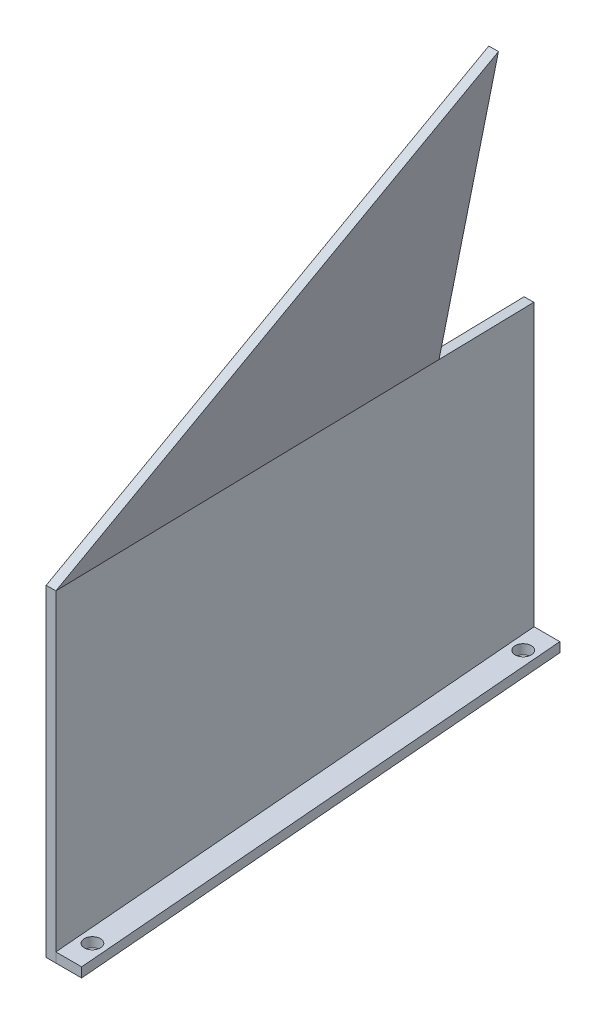
ISO-10303-21;
HEADER;
FILE_DESCRIPTION(('STEP AP214'),'2;1');
FILE_NAME('part.step','',(''),(''),'','','');
FILE_SCHEMA(('AUTOMOTIVE_DESIGN { 1 0 10303 214 1 1 1 1 }'));
ENDSEC;
DATA;
#1=APPLICATION_CONTEXT('core data for automotive mechanical design processes');
#2=APPLICATION_PROTOCOL_DEFINITION('international standard','automotive_design',2000,#1);
#3=PRODUCT_CONTEXT('',#1,'mechanical');
#4=PRODUCT('Part','Part','',(#3));
#5=PRODUCT_RELATED_PRODUCT_CATEGORY('part','',(#4));
#6=PRODUCT_DEFINITION_FORMATION('','',#4);
#7=PRODUCT_DEFINITION_CONTEXT('part definition',#1,'design');
#8=PRODUCT_DEFINITION('design','',#6,#7);
#9=PRODUCT_DEFINITION_SHAPE('','',#8);
#10=(LENGTH_UNIT() NAMED_UNIT(*) SI_UNIT(.MILLI.,.METRE.));
#11=(NAMED_UNIT(*) PLANE_ANGLE_UNIT() SI_UNIT($,.RADIAN.));
#12=(NAMED_UNIT(*) SI_UNIT($,.STERADIAN.) SOLID_ANGLE_UNIT());
#13=UNCERTAINTY_MEASURE_WITH_UNIT(LENGTH_MEASURE(1.E-05),#10,'distance_accuracy_value','');
#14=(GEOMETRIC_REPRESENTATION_CONTEXT(3) GLOBAL_UNCERTAINTY_ASSIGNED_CONTEXT((#13)) GLOBAL_UNIT_ASSIGNED_CONTEXT((#10,
#11,#12)) REPRESENTATION_CONTEXT('',''));
#15=CARTESIAN_POINT('',(0.,0.,0.));
#16=DIRECTION('',(0.,0.,1.));
#17=DIRECTION('',(1.,0.,0.));
#18=AXIS2_PLACEMENT_3D('',#15,#16,#17);
#19=CARTESIAN_POINT('',(-203.417237749036,0.,16.7339405979292));
#20=DIRECTION('',(0.99673005629727,0.,-0.0808034335510675));
#21=DIRECTION('',(-0.0808034335510675,0.,-0.99673005629727));
#22=AXIS2_PLACEMENT_3D('',#19,#20,#21);
#23=PLANE('',#22);
#24=DIRECTION('',(0.,-1.,0.));
#25=VECTOR('',#24,1.);
#26=CARTESIAN_POINT('',(-188.85310393892,113.192378864667,196.386082524594));
#27=LINE('',#26,#25);
#28=CARTESIAN_POINT('',(-188.85310393892,113.192378864667,196.386082524594));
#29=VERTEX_POINT('',#28);
#30=CARTESIAN_POINT('',(-188.85310393892,23.,196.386082524594));
#31=VERTEX_POINT('',#30);
#32=EDGE_CURVE('E111',#29,#31,#27,.T.);
#33=ORIENTED_EDGE('',*,*,#32,.F.);
#34=DIRECTION('',(-0.0806591251309432,-0.0597381729358026,-0.99494997674627));
#35=VECTOR('',#34,1.);
#36=CARTESIAN_POINT('',(-175.773130317925,122.879735687572,357.730746614663));
#37=LINE('',#36,#35);
#38=CARTESIAN_POINT('',(-186.258816584948,115.113773205917,228.387249637648));
#39=VERTEX_POINT('',#38);
#40=EDGE_CURVE('E263',#39,#29,#37,.T.);
#41=ORIENTED_EDGE('',*,*,#40,.F.);
#42=CARTESIAN_POINT('',(-175.773130317925,122.879735687572,357.730746614663));
#43=VERTEX_POINT('',#42);
#44=EDGE_CURVE('E119',#43,#39,#37,.T.);
#45=ORIENTED_EDGE('',*,*,#44,.F.);
#46=DIRECTION('',(0.,1.,0.));
#47=VECTOR('',#46,1.);
#48=CARTESIAN_POINT('',(-175.773130317925,22.8797356875718,357.730746614663));
#49=LINE('',#48,#47);
#50=CARTESIAN_POINT('',(-175.773220921356,25.8797365209757,357.730746614663));
#51=VERTEX_POINT('',#50);
#52=EDGE_CURVE('E276',#51,#43,#49,.T.);
#53=ORIENTED_EDGE('',*,*,#52,.F.);
#54=DIRECTION('',(-0.0808034112503375,0.00074295002248931,-0.996729781212327));
#55=VECTOR('',#54,1.);
#56=CARTESIAN_POINT('',(-203.415668854651,26.1338968875955,16.7532932927375));
#57=LINE('',#56,#55);
#58=CARTESIAN_POINT('',(-176.208192950609,25.8837367208027,352.364142970064));
#59=VERTEX_POINT('',#58);
#60=EDGE_CURVE('E127',#51,#59,#57,.T.);
#61=ORIENTED_EDGE('',*,*,#60,.T.);
#62=DIRECTION('',(-0.080769976135857,0.000742952042466884,-0.996732491181699));
#63=VECTOR('',#62,1.);
#64=CARTESIAN_POINT('',(-175.773130317925,25.8797348541681,357.732982776851));
#65=LINE('',#64,#63);
#66=CARTESIAN_POINT('',(-176.208199581132,25.88373678178,352.364061163911));
#67=VERTEX_POINT('',#66);
#68=EDGE_CURVE('E249',#59,#67,#65,.T.);
#69=ORIENTED_EDGE('',*,*,#68,.T.);
#70=DIRECTION('',(-0.0705639806435784,0.487219606824506,-0.870423907852666));
#71=VECTOR('',#70,1.);
#72=CARTESIAN_POINT('',(-196.068389250579,163.011400413505,107.383778800142));
#73=LINE('',#72,#71);
#74=CARTESIAN_POINT('',(-175.773130317925,22.8797356875718,357.730746614663));
#75=VERTEX_POINT('',#74);
#76=EDGE_CURVE('E264',#75,#67,#73,.T.);
#77=ORIENTED_EDGE('',*,*,#76,.F.);
#78=DIRECTION('',(0.0808034112503379,-0.000742950022489317,0.996729781212327));
#79=VECTOR('',#78,1.);
#80=CARTESIAN_POINT('',(-188.85310393892,23.,196.386082524594));
#81=LINE('',#80,#79);
#82=EDGE_CURVE('E309',#31,#75,#81,.T.);
#83=ORIENTED_EDGE('',*,*,#82,.F.);
#84=EDGE_LOOP('',(#33,#41,#45,#53,#61,#69,#77,#83));
#85=FACE_BOUND('',#84,.T.);
#86=ADVANCED_FACE('F101',(#85),#23,.T.);
#87=CARTESIAN_POINT('',(-206.417237749036,0.,16.7339405979292));
#88=DIRECTION('',(0.99673005629727,0.,-0.0808034335510675));
#89=DIRECTION('',(-0.0808034335510675,0.,-0.99673005629727));
#90=AXIS2_PLACEMENT_3D('',#87,#88,#89);
#91=PLANE('',#90);
#92=DIRECTION('',(0.,-1.,0.));
#93=VECTOR('',#92,1.);
#94=CARTESIAN_POINT('',(-191.85310393892,113.192378864667,196.386082524594));
#95=LINE('',#94,#93);
#96=CARTESIAN_POINT('',(-191.85310393892,113.192378864667,196.386082524594));
#97=VERTEX_POINT('',#96);
#98=CARTESIAN_POINT('',(-191.85310393892,23.,196.386082524594));
#99=VERTEX_POINT('',#98);
#100=EDGE_CURVE('E12',#97,#99,#95,.T.);
#101=ORIENTED_EDGE('',*,*,#100,.T.);
#102=DIRECTION('',(0.0808034112503379,-0.000742950022489317,0.996729781212327));
#103=VECTOR('',#102,1.);
#104=CARTESIAN_POINT('',(-191.85310393892,23.,196.386082524594));
#105=LINE('',#104,#103);
#106=CARTESIAN_POINT('',(-178.773130317925,22.8797356875718,357.730746614663));
#107=VERTEX_POINT('',#106);
#108=EDGE_CURVE('E306',#99,#107,#105,.T.);
#109=ORIENTED_EDGE('',*,*,#108,.T.);
#110=DIRECTION('',(0.,1.,0.));
#111=VECTOR('',#110,1.);
#112=CARTESIAN_POINT('',(-178.773130317925,22.8797356875718,357.730746614663));
#113=LINE('',#112,#111);
#114=CARTESIAN_POINT('',(-178.773130317925,122.879735687572,357.730746614663));
#115=VERTEX_POINT('',#114);
#116=EDGE_CURVE('E314',#107,#115,#113,.T.);
#117=ORIENTED_EDGE('',*,*,#116,.T.);
#118=DIRECTION('',(-0.0806591251309432,-0.0597381729358026,-0.99494997674627));
#119=VECTOR('',#118,1.);
#120=CARTESIAN_POINT('',(-178.773130317925,122.879735687572,357.730746614663));
#121=LINE('',#120,#119);
#122=CARTESIAN_POINT('',(-189.258816584948,115.113773205917,228.387249637648));
#123=VERTEX_POINT('',#122);
#124=EDGE_CURVE('E207',#115,#123,#121,.T.);
#125=ORIENTED_EDGE('',*,*,#124,.T.);
#126=EDGE_CURVE('E104',#123,#97,#121,.T.);
#127=ORIENTED_EDGE('',*,*,#126,.T.);
#128=EDGE_LOOP('',(#101,#109,#117,#125,#127));
#129=FACE_BOUND('',#128,.T.);
#130=ADVANCED_FACE('F393',(#129),#91,.F.);
#131=CARTESIAN_POINT('',(-178.773130317925,122.879735687572,357.730746614663));
#132=DIRECTION('',(0.,-0.99820237497231,0.0599334514243942));
#133=DIRECTION('',(0.,-0.0599334514243942,-0.99820237497231));
#134=AXIS2_PLACEMENT_3D('',#131,#132,#133);
#135=PLANE('',#134);
#136=ORIENTED_EDGE('',*,*,#126,.F.);
#137=DIRECTION('',(1.,0.,0.));
#138=VECTOR('',#137,1.);
#139=CARTESIAN_POINT('',(-189.258816584948,115.113773205917,228.387249637648));
#140=LINE('',#139,#138);
#141=EDGE_CURVE('E196',#123,#39,#140,.T.);
#142=ORIENTED_EDGE('',*,*,#141,.T.);
#143=ORIENTED_EDGE('',*,*,#40,.T.);
#144=DIRECTION('',(1.,0.,0.));
#145=VECTOR('',#144,1.);
#146=CARTESIAN_POINT('',(-191.85310393892,113.192378864667,196.386082524594));
#147=LINE('',#146,#145);
#148=EDGE_CURVE('E265',#97,#29,#147,.T.);
#149=ORIENTED_EDGE('',*,*,#148,.F.);
#150=EDGE_LOOP('',(#136,#142,#143,#149));
#151=FACE_BOUND('',#150,.T.);
#152=ADVANCED_FACE('F416',(#151),#135,.F.);
#153=CARTESIAN_POINT('',(-178.773130317925,22.8797356875718,357.730746614663));
#154=DIRECTION('',(0.,0.,-1.));
#155=DIRECTION('',(0.,1.,0.));
#156=AXIS2_PLACEMENT_3D('',#153,#154,#155);
#157=PLANE('',#156);
#158=DIRECTION('',(1.,0.,0.));
#159=VECTOR('',#158,1.);
#160=CARTESIAN_POINT('',(-178.773130317925,22.8797356875718,357.730746614663));
#161=LINE('',#160,#159);
#162=EDGE_CURVE('E317',#107,#75,#161,.T.);
#163=ORIENTED_EDGE('',*,*,#162,.T.);
#164=DIRECTION('',(-6.04022702999892E-05,0.999999998175783,0.));
#165=VECTOR('',#164,1.);
#166=CARTESIAN_POINT('',(-175.77313032887,22.8799168943823,357.730746614663));
#167=LINE('',#166,#165);
#168=EDGE_CURVE('E258',#75,#51,#167,.T.);
#169=ORIENTED_EDGE('',*,*,#168,.T.);
#170=ORIENTED_EDGE('',*,*,#52,.T.);
#171=DIRECTION('',(1.,0.,0.));
#172=VECTOR('',#171,1.);
#173=CARTESIAN_POINT('',(-178.773130317925,122.879735687572,357.730746614663));
#174=LINE('',#173,#172);
#175=EDGE_CURVE('E329',#115,#43,#174,.T.);
#176=ORIENTED_EDGE('',*,*,#175,.F.);
#177=ORIENTED_EDGE('',*,*,#116,.F.);
#178=EDGE_LOOP('',(#163,#169,#170,#176,#177));
#179=FACE_BOUND('',#178,.T.);
#180=ADVANCED_FACE('F389',(#179),#157,.F.);
#181=CARTESIAN_POINT('',(-191.85310393892,23.,196.386082524594));
#182=DIRECTION('',(0.,0.999999722198777,0.000745387395963266));
#183=DIRECTION('',(0.,-0.000745387395963266,0.999999722198777));
#184=AXIS2_PLACEMENT_3D('',#181,#182,#183);
#185=PLANE('',#184);
#186=ORIENTED_EDGE('',*,*,#82,.T.);
#187=ORIENTED_EDGE('',*,*,#162,.F.);
#188=ORIENTED_EDGE('',*,*,#108,.F.);
#189=DIRECTION('',(1.,0.,0.));
#190=VECTOR('',#189,1.);
#191=CARTESIAN_POINT('',(-191.85310393892,23.,196.386082524594));
#192=LINE('',#191,#190);
#193=EDGE_CURVE('E313',#99,#31,#192,.T.);
#194=ORIENTED_EDGE('',*,*,#193,.T.);
#195=EDGE_LOOP('',(#186,#187,#188,#194));
#196=FACE_BOUND('',#195,.T.);
#197=ADVANCED_FACE('F385',(#196),#185,.F.);
#198=CARTESIAN_POINT('',(-191.85310393892,113.192378864667,196.386082524594));
#199=DIRECTION('',(0.,0.,1.));
#200=DIRECTION('',(1.,0.,0.));
#201=AXIS2_PLACEMENT_3D('',#198,#199,#200);
#202=PLANE('',#201);
#203=ORIENTED_EDGE('',*,*,#32,.T.);
#204=ORIENTED_EDGE('',*,*,#193,.F.);
#205=ORIENTED_EDGE('',*,*,#100,.F.);
#206=ORIENTED_EDGE('',*,*,#148,.T.);
#207=EDGE_LOOP('',(#203,#204,#205,#206));
#208=FACE_BOUND('',#207,.T.);
#209=ADVANCED_FACE('F423',(#208),#202,.F.);
#210=CARTESIAN_POINT('',(-175.773130317925,25.8797348541681,357.732982776851));
#211=DIRECTION('',(-0.996732768075282,-6.02049221839216E-05,0.0807699536978588));
#212=DIRECTION('',(0.0807699538442395,0.,0.996732769881677));
#213=AXIS2_PLACEMENT_3D('',#210,#211,#212);
#214=PLANE('',#213);
#215=ORIENTED_EDGE('',*,*,#168,.F.);
#216=DIRECTION('',(0.,-0.999999722198776,-0.000745387395963266));
#217=VECTOR('',#216,1.);
#218=CARTESIAN_POINT('',(-175.773130317925,25.8797348541681,357.732982776851));
#219=LINE('',#218,#217);
#220=CARTESIAN_POINT('',(-175.773130317925,25.8797348541681,357.732982776851));
#221=VERTEX_POINT('',#220);
#222=EDGE_CURVE('E279',#221,#75,#219,.T.);
#223=ORIENTED_EDGE('',*,*,#222,.F.);
#224=EDGE_CURVE('E254',#221,#51,#65,.T.);
#225=ORIENTED_EDGE('',*,*,#224,.T.);
#226=EDGE_LOOP('',(#215,#223,#225));
#227=FACE_BOUND('',#226,.T.);
#228=ADVANCED_FACE('F425',(#227),#214,.T.);
#229=DIRECTION('',(-0.080769976135857,0.000742952042466884,-0.996732491181699));
#230=VECTOR('',#229,1.);
#231=CARTESIAN_POINT('',(-175.773130317925,22.8797356875718,357.730746614663));
#232=LINE('',#231,#230);
#233=CARTESIAN_POINT('',(-188.85310393892,23.0000501110995,196.318854280852));
#234=VERTEX_POINT('',#233);
#235=EDGE_CURVE('E241',#75,#234,#232,.T.);
#236=ORIENTED_EDGE('',*,*,#235,.F.);
#237=ORIENTED_EDGE('',*,*,#76,.T.);
#238=CARTESIAN_POINT('',(-188.85310393892,26.0000492776958,196.32109044304));
#239=VERTEX_POINT('',#238);
#240=EDGE_CURVE('E245',#67,#239,#65,.T.);
#241=ORIENTED_EDGE('',*,*,#240,.T.);
#242=DIRECTION('',(0.,-0.999999722198776,-0.000745387395963266));
#243=VECTOR('',#242,1.);
#244=CARTESIAN_POINT('',(-188.85310393892,26.0000492776958,196.32109044304));
#245=LINE('',#244,#243);
#246=EDGE_CURVE('E341',#239,#234,#245,.T.);
#247=ORIENTED_EDGE('',*,*,#246,.T.);
#248=EDGE_LOOP('',(#236,#237,#241,#247));
#249=FACE_BOUND('',#248,.T.);
#250=ADVANCED_FACE('F431',(#249),#214,.T.);
#251=CARTESIAN_POINT('',(-175.773130317925,25.8797348541681,357.732982776851));
#252=DIRECTION('',(0.,-0.000745387395963266,0.999999722198776));
#253=DIRECTION('',(0.,-0.999999722198776,-0.000745387395963266));
#254=AXIS2_PLACEMENT_3D('',#251,#252,#253);
#255=PLANE('',#254);
#256=DIRECTION('',(-1.,0.,0.));
#257=VECTOR('',#256,1.);
#258=CARTESIAN_POINT('',(-175.773130317925,22.8797356875718,357.730746614663));
#259=LINE('',#258,#257);
#260=CARTESIAN_POINT('',(-167.773130317925,22.8797356875718,357.730746614663));
#261=VERTEX_POINT('',#260);
#262=EDGE_CURVE('E250',#261,#75,#259,.T.);
#263=ORIENTED_EDGE('',*,*,#262,.F.);
#264=DIRECTION('',(0.,-0.999999722198776,-0.000745387395963266));
#265=VECTOR('',#264,1.);
#266=CARTESIAN_POINT('',(-167.773130317925,25.8797348541681,357.732982776851));
#267=LINE('',#266,#265);
#268=CARTESIAN_POINT('',(-167.773130317925,25.8797348541681,357.732982776851));
#269=VERTEX_POINT('',#268);
#270=EDGE_CURVE('E283',#269,#261,#267,.T.);
#271=ORIENTED_EDGE('',*,*,#270,.F.);
#272=DIRECTION('',(-1.,0.,0.));
#273=VECTOR('',#272,1.);
#274=CARTESIAN_POINT('',(-175.773130317925,25.8797348541681,357.732982776851));
#275=LINE('',#274,#273);
#276=EDGE_CURVE('E344',#269,#221,#275,.T.);
#277=ORIENTED_EDGE('',*,*,#276,.T.);
#278=ORIENTED_EDGE('',*,*,#222,.T.);
#279=EDGE_LOOP('',(#263,#271,#277,#278));
#280=FACE_BOUND('',#279,.T.);
#281=ADVANCED_FACE('F375',(#280),#255,.T.);
#282=CARTESIAN_POINT('',(-180.85310393892,26.0000492776958,196.32109044304));
#283=DIRECTION('',(0.996732768075282,6.02049221839216E-05,-0.0807699536978588));
#284=DIRECTION('',(-0.0807699538442395,0.,-0.996732769881677));
#285=AXIS2_PLACEMENT_3D('',#282,#283,#284);
#286=PLANE('',#285);
#287=DIRECTION('',(0.080769976135857,-0.000742952042466884,0.996732491181699));
#288=VECTOR('',#287,1.);
#289=CARTESIAN_POINT('',(-180.85310393892,23.0000501110995,196.318854280852));
#290=LINE('',#289,#288);
#291=CARTESIAN_POINT('',(-180.85310393892,23.0000501110995,196.318854280852));
#292=VERTEX_POINT('',#291);
#293=EDGE_CURVE('E295',#292,#261,#290,.T.);
#294=ORIENTED_EDGE('',*,*,#293,.F.);
#295=DIRECTION('',(0.,-0.999999722198776,-0.000745387395963266));
#296=VECTOR('',#295,1.);
#297=CARTESIAN_POINT('',(-180.85310393892,26.0000492776958,196.32109044304));
#298=LINE('',#297,#296);
#299=CARTESIAN_POINT('',(-180.85310393892,26.0000492776958,196.32109044304));
#300=VERTEX_POINT('',#299);
#301=EDGE_CURVE('E338',#300,#292,#298,.T.);
#302=ORIENTED_EDGE('',*,*,#301,.F.);
#303=DIRECTION('',(0.080769976135857,-0.000742952042466884,0.996732491181699));
#304=VECTOR('',#303,1.);
#305=CARTESIAN_POINT('',(-180.85310393892,26.0000492776958,196.32109044304));
#306=LINE('',#305,#304);
#307=EDGE_CURVE('E347',#300,#269,#306,.T.);
#308=ORIENTED_EDGE('',*,*,#307,.T.);
#309=ORIENTED_EDGE('',*,*,#270,.T.);
#310=EDGE_LOOP('',(#294,#302,#308,#309));
#311=FACE_BOUND('',#310,.T.);
#312=ADVANCED_FACE('F372',(#311),#286,.T.);
#313=CARTESIAN_POINT('',(-188.85310393892,26.0000492776958,196.32109044304));
#314=DIRECTION('',(0.,0.000745387395963266,-0.999999722198776));
#315=DIRECTION('',(0.,0.999999722198776,0.000745387395963266));
#316=AXIS2_PLACEMENT_3D('',#313,#314,#315);
#317=PLANE('',#316);
#318=DIRECTION('',(1.,0.,0.));
#319=VECTOR('',#318,1.);
#320=CARTESIAN_POINT('',(-188.85310393892,23.0000501110995,196.318854280852));
#321=LINE('',#320,#319);
#322=EDGE_CURVE('E289',#234,#292,#321,.T.);
#323=ORIENTED_EDGE('',*,*,#322,.F.);
#324=ORIENTED_EDGE('',*,*,#246,.F.);
#325=DIRECTION('',(1.,0.,0.));
#326=VECTOR('',#325,1.);
#327=CARTESIAN_POINT('',(-188.85310393892,26.0000492776958,196.32109044304));
#328=LINE('',#327,#326);
#329=EDGE_CURVE('E251',#239,#300,#328,.T.);
#330=ORIENTED_EDGE('',*,*,#329,.T.);
#331=ORIENTED_EDGE('',*,*,#301,.T.);
#332=EDGE_LOOP('',(#323,#324,#330,#331));
#333=FACE_BOUND('',#332,.T.);
#334=ADVANCED_FACE('F368',(#333),#317,.T.);
#335=CARTESIAN_POINT('',(0.,26.1463700577327,0.0194891801053432));
#336=DIRECTION('',(0.,-0.999999722198776,-0.000745387395963258));
#337=DIRECTION('',(0.,0.000745387395963258,-0.999999722198776));
#338=AXIS2_PLACEMENT_3D('',#335,#336,#337);
#339=PLANE('',#338);
#340=ORIENTED_EDGE('',*,*,#60,.F.);
#341=ORIENTED_EDGE('',*,*,#224,.F.);
#342=ORIENTED_EDGE('',*,*,#276,.F.);
#343=ORIENTED_EDGE('',*,*,#307,.F.);
#344=ORIENTED_EDGE('',*,*,#329,.F.);
#345=ORIENTED_EDGE('',*,*,#240,.F.);
#346=ORIENTED_EDGE('',*,*,#68,.F.);
#347=EDGE_LOOP('',(#340,#341,#342,#343,#344,#345,#346));
#348=FACE_BOUND('',#347,.T.);
#349=CARTESIAN_POINT('',(-184.217937822519,25.9940861785281,204.32108822063));
#350=DIRECTION('',(0.,-0.999999722198776,-0.000745387395963266));
#351=DIRECTION('',(0.,0.000745387395963266,-0.999999722198776));
#352=AXIS2_PLACEMENT_3D('',#349,#350,#351);
#353=CIRCLE('',#352,2.5);
#354=CARTESIAN_POINT('',(-184.217937822519,25.995949647018,201.821088915133));
#355=VERTEX_POINT('',#354);
#356=EDGE_CURVE('E229',#355,#355,#353,.T.);
#357=ORIENTED_EDGE('',*,*,#356,.T.);
#358=EDGE_LOOP('',(#357));
#359=FACE_BOUND('',#358,.T.);
#360=CARTESIAN_POINT('',(-172.43451996809,25.8856979533358,349.732984999261));
#361=DIRECTION('',(0.,-0.999999722198776,-0.000745387395963266));
#362=DIRECTION('',(0.,0.000745387395963266,-0.999999722198776));
#363=AXIS2_PLACEMENT_3D('',#360,#361,#362);
#364=CIRCLE('',#363,2.49999999999999);
#365=CARTESIAN_POINT('',(-172.43451996809,25.8875614218257,347.232985693764));
#366=VERTEX_POINT('',#365);
#367=EDGE_CURVE('E237',#366,#366,#364,.T.);
#368=ORIENTED_EDGE('',*,*,#367,.T.);
#369=EDGE_LOOP('',(#368));
#370=FACE_BOUND('',#369,.T.);
#371=ADVANCED_FACE('F537',(#348,#359,#370),#339,.F.);
#372=CARTESIAN_POINT('',(0.,23.1463708911363,0.0172530179174534));
#373=DIRECTION('',(0.,-0.999999722198776,-0.000745387395963258));
#374=DIRECTION('',(0.,0.000745387395963258,-0.999999722198776));
#375=AXIS2_PLACEMENT_3D('',#372,#373,#374);
#376=PLANE('',#375);
#377=CARTESIAN_POINT('',(-184.217937822519,22.9940870119318,204.318852058442));
#378=DIRECTION('',(0.,-0.999999722198776,-0.000745387395963266));
#379=DIRECTION('',(0.,0.000745387395963266,-0.999999722198776));
#380=AXIS2_PLACEMENT_3D('',#377,#378,#379);
#381=CIRCLE('',#380,2.5);
#382=CARTESIAN_POINT('',(-184.217937822519,22.9959504804217,201.818852752945));
#383=VERTEX_POINT('',#382);
#384=EDGE_CURVE('E201',#383,#383,#381,.T.);
#385=ORIENTED_EDGE('',*,*,#384,.F.);
#386=EDGE_LOOP('',(#385));
#387=FACE_BOUND('',#386,.T.);
#388=CARTESIAN_POINT('',(-172.43451996809,22.8856987867395,349.730748837073));
#389=DIRECTION('',(0.,-0.999999722198776,-0.000745387395963266));
#390=DIRECTION('',(0.,0.000745387395963266,-0.999999722198776));
#391=AXIS2_PLACEMENT_3D('',#388,#389,#390);
#392=CIRCLE('',#391,2.49999999999999);
#393=CARTESIAN_POINT('',(-172.43451996809,22.8875622552294,347.230749531576));
#394=VERTEX_POINT('',#393);
#395=EDGE_CURVE('E233',#394,#394,#392,.T.);
#396=ORIENTED_EDGE('',*,*,#395,.F.);
#397=EDGE_LOOP('',(#396));
#398=FACE_BOUND('',#397,.T.);
#399=ORIENTED_EDGE('',*,*,#235,.T.);
#400=ORIENTED_EDGE('',*,*,#322,.T.);
#401=ORIENTED_EDGE('',*,*,#293,.T.);
#402=ORIENTED_EDGE('',*,*,#262,.T.);
#403=EDGE_LOOP('',(#399,#400,#401,#402));
#404=FACE_BOUND('',#403,.T.);
#405=ADVANCED_FACE('F362',(#387,#398,#404),#376,.T.);
#406=CARTESIAN_POINT('',(-172.43451996809,25.8856979533358,349.732984999261));
#407=DIRECTION('',(0.,-0.999999722198776,-0.000745387395963266));
#408=DIRECTION('',(0.,0.000745387395963266,-0.999999722198776));
#409=AXIS2_PLACEMENT_3D('',#406,#407,#408);
#410=CYLINDRICAL_SURFACE('',#409,2.49999999999999);
#411=ORIENTED_EDGE('',*,*,#367,.F.);
#412=EDGE_LOOP('',(#411));
#413=FACE_BOUND('',#412,.T.);
#414=ORIENTED_EDGE('',*,*,#395,.T.);
#415=EDGE_LOOP('',(#414));
#416=FACE_BOUND('',#415,.T.);
#417=ADVANCED_FACE('F520',(#413,#416),#410,.F.);
#418=CARTESIAN_POINT('',(-184.217937822519,25.9940861785281,204.32108822063));
#419=DIRECTION('',(0.,-0.999999722198776,-0.000745387395963266));
#420=DIRECTION('',(0.,0.000745387395963266,-0.999999722198776));
#421=AXIS2_PLACEMENT_3D('',#418,#419,#420);
#422=CYLINDRICAL_SURFACE('',#421,2.5);
#423=ORIENTED_EDGE('',*,*,#356,.F.);
#424=EDGE_LOOP('',(#423));
#425=FACE_BOUND('',#424,.T.);
#426=ORIENTED_EDGE('',*,*,#384,.T.);
#427=EDGE_LOOP('',(#426));
#428=FACE_BOUND('',#427,.T.);
#429=ADVANCED_FACE('F451',(#425,#428),#422,.F.);
#430=CARTESIAN_POINT('',(-214.970791787154,63.1625463993318,13.8782035001777));
#431=DIRECTION('',(0.958695846657333,-0.277806353781889,-0.0610401785743745));
#432=DIRECTION('',(0.27832534433363,0.960486857120682,0.));
#433=AXIS2_PLACEMENT_3D('',#430,#431,#432);
#434=PLANE('',#433);
#435=ORIENTED_EDGE('',*,*,#44,.T.);
#436=DIRECTION('',(0.28323883184156,0.952073886578041,0.115460290287228));
#437=VECTOR('',#436,1.);
#438=CARTESIAN_POINT('',(-186.258816584948,115.113773205917,228.387249637648));
#439=LINE('',#438,#437);
#440=CARTESIAN_POINT('',(-155.131777697237,219.743638746621,241.075965102226));
#441=VERTEX_POINT('',#440);
#442=EDGE_CURVE('E202',#39,#441,#439,.T.);
#443=ORIENTED_EDGE('',*,*,#442,.T.);
#444=DIRECTION('',(-0.134887699231823,-0.632988993616352,0.762318990027471));
#445=VECTOR('',#444,1.);
#446=CARTESIAN_POINT('',(-155.131777697237,219.743638746621,241.075965102226));
#447=LINE('',#446,#445);
#448=EDGE_CURVE('E213',#441,#43,#447,.T.);
#449=ORIENTED_EDGE('',*,*,#448,.T.);
#450=EDGE_LOOP('',(#435,#443,#449));
#451=FACE_BOUND('',#450,.T.);
#452=ADVANCED_FACE('F477',(#451),#434,.T.);
#453=CARTESIAN_POINT('',(-217.970791787154,63.1625463993318,13.8782035001777));
#454=DIRECTION('',(0.958695846657333,-0.277806353781889,-0.0610401785743745));
#455=DIRECTION('',(0.27832534433363,0.960486857120682,0.));
#456=AXIS2_PLACEMENT_3D('',#453,#454,#455);
#457=PLANE('',#456);
#458=ORIENTED_EDGE('',*,*,#124,.F.);
#459=DIRECTION('',(-0.134887699231823,-0.632988993616352,0.762318990027471));
#460=VECTOR('',#459,1.);
#461=CARTESIAN_POINT('',(-158.131777697237,219.743638746621,241.075965102226));
#462=LINE('',#461,#460);
#463=CARTESIAN_POINT('',(-158.131777697237,219.743638746621,241.075965102226));
#464=VERTEX_POINT('',#463);
#465=EDGE_CURVE('E204',#464,#115,#462,.T.);
#466=ORIENTED_EDGE('',*,*,#465,.F.);
#467=DIRECTION('',(0.28323883184156,0.952073886578041,0.115460290287228));
#468=VECTOR('',#467,1.);
#469=CARTESIAN_POINT('',(-189.258816584948,115.113773205917,228.387249637648));
#470=LINE('',#469,#468);
#471=EDGE_CURVE('E190',#123,#464,#470,.T.);
#472=ORIENTED_EDGE('',*,*,#471,.F.);
#473=EDGE_LOOP('',(#458,#466,#472));
#474=FACE_BOUND('',#473,.T.);
#475=ADVANCED_FACE('F205',(#474),#457,.F.);
#476=CARTESIAN_POINT('',(-189.258816584948,115.113773205917,228.387249637648));
#477=DIRECTION('',(0.,0.120390346423103,-0.992726631297924));
#478=DIRECTION('',(0.,0.992726631297924,0.120390346423103));
#479=AXIS2_PLACEMENT_3D('',#476,#477,#478);
#480=PLANE('',#479);
#481=ORIENTED_EDGE('',*,*,#442,.F.);
#482=ORIENTED_EDGE('',*,*,#141,.F.);
#483=ORIENTED_EDGE('',*,*,#471,.T.);
#484=DIRECTION('',(1.,0.,0.));
#485=VECTOR('',#484,1.);
#486=CARTESIAN_POINT('',(-158.131777697237,219.743638746621,241.075965102226));
#487=LINE('',#486,#485);
#488=EDGE_CURVE('E194',#464,#441,#487,.T.);
#489=ORIENTED_EDGE('',*,*,#488,.T.);
#490=EDGE_LOOP('',(#481,#482,#483,#489));
#491=FACE_BOUND('',#490,.T.);
#492=ADVANCED_FACE('F192',(#491),#480,.T.);
#493=CARTESIAN_POINT('',(-158.131777697237,219.743638746621,241.075965102226));
#494=DIRECTION('',(0.,0.769350163758838,0.638827304930096));
#495=DIRECTION('',(0.,-0.638827304930096,0.769350163758838));
#496=AXIS2_PLACEMENT_3D('',#493,#494,#495);
#497=PLANE('',#496);
#498=ORIENTED_EDGE('',*,*,#448,.F.);
#499=ORIENTED_EDGE('',*,*,#488,.F.);
#500=ORIENTED_EDGE('',*,*,#465,.T.);
#501=ORIENTED_EDGE('',*,*,#175,.T.);
#502=EDGE_LOOP('',(#498,#499,#500,#501));
#503=FACE_BOUND('',#502,.T.);
#504=ADVANCED_FACE('F212',(#503),#497,.T.);
#505=CLOSED_SHELL('',(#86,#130,#152,#180,#197,#209,#228,#250,#281,#312,#334,#371,#405,#417,#429,
#452,#475,#492,#504));
#506=MANIFOLD_SOLID_BREP('B2',#505);
#507=ADVANCED_BREP_SHAPE_REPRESENTATION('',(#18,#506),#14);
#508=SHAPE_DEFINITION_REPRESENTATION(#9,#507);
ENDSEC;
END-ISO-10303-21;
